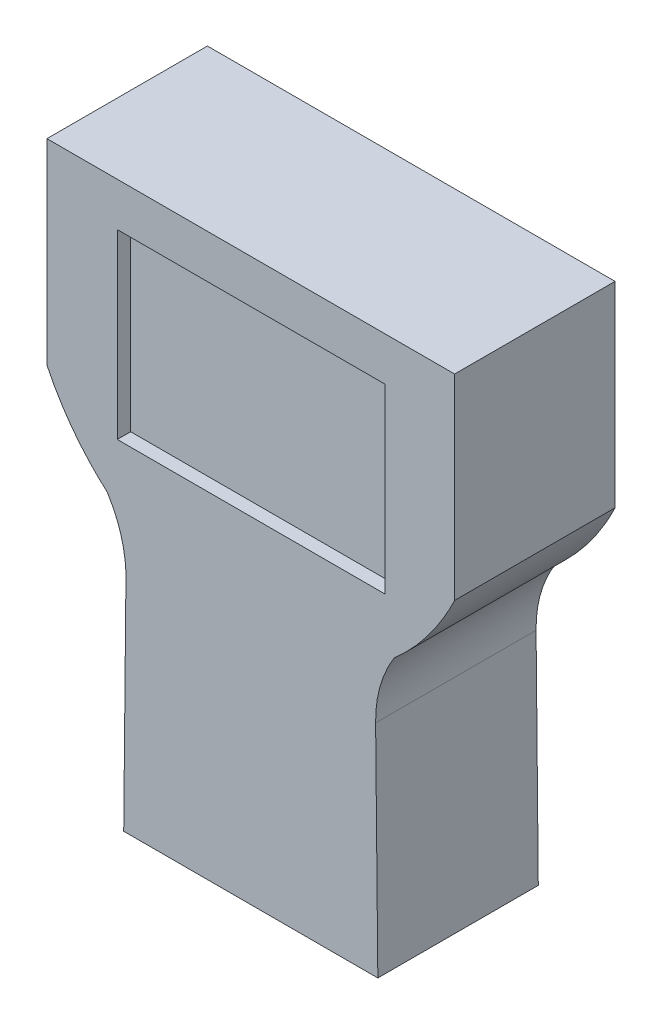
ISO-10303-21;
HEADER;
FILE_DESCRIPTION(('STEP AP214'),'2;1');
FILE_NAME('part.step','',(''),(''),'','','');
FILE_SCHEMA(('AUTOMOTIVE_DESIGN { 1 0 10303 214 1 1 1 1 }'));
ENDSEC;
DATA;
#1=APPLICATION_CONTEXT('core data for automotive mechanical design processes');
#2=APPLICATION_PROTOCOL_DEFINITION('international standard','automotive_design',2000,#1);
#3=PRODUCT_CONTEXT('',#1,'mechanical');
#4=PRODUCT('Part','Part','',(#3));
#5=PRODUCT_RELATED_PRODUCT_CATEGORY('part','',(#4));
#6=PRODUCT_DEFINITION_FORMATION('','',#4);
#7=PRODUCT_DEFINITION_CONTEXT('part definition',#1,'design');
#8=PRODUCT_DEFINITION('design','',#6,#7);
#9=PRODUCT_DEFINITION_SHAPE('','',#8);
#10=(LENGTH_UNIT() NAMED_UNIT(*) SI_UNIT(.MILLI.,.METRE.));
#11=(NAMED_UNIT(*) PLANE_ANGLE_UNIT() SI_UNIT($,.RADIAN.));
#12=(NAMED_UNIT(*) SI_UNIT($,.STERADIAN.) SOLID_ANGLE_UNIT());
#13=UNCERTAINTY_MEASURE_WITH_UNIT(LENGTH_MEASURE(1.E-05),#10,'distance_accuracy_value','');
#14=(GEOMETRIC_REPRESENTATION_CONTEXT(3) GLOBAL_UNCERTAINTY_ASSIGNED_CONTEXT((#13)) GLOBAL_UNIT_ASSIGNED_CONTEXT((#10,
#11,#12)) REPRESENTATION_CONTEXT('',''));
#15=CARTESIAN_POINT('',(0.,0.,0.));
#16=DIRECTION('',(0.,0.,1.));
#17=DIRECTION('',(1.,0.,0.));
#18=AXIS2_PLACEMENT_3D('',#15,#16,#17);
#19=CARTESIAN_POINT('',(-30.1445416899274,29.3855430183357,30.));
#20=DIRECTION('',(0.,-1.,0.));
#21=DIRECTION('',(0.,0.,-1.));
#22=AXIS2_PLACEMENT_3D('',#19,#20,#21);
#23=PLANE('',#22);
#24=DIRECTION('',(-1.,0.,0.));
#25=VECTOR('',#24,1.);
#26=CARTESIAN_POINT('',(-30.1445416899274,29.3855430183357,0.));
#27=LINE('',#26,#25);
#28=CARTESIAN_POINT('',(46.0787537208365,29.3855430183357,0.));
#29=VERTEX_POINT('',#28);
#30=CARTESIAN_POINT('',(-30.1445416899274,29.3855430183357,0.));
#31=VERTEX_POINT('',#30);
#32=EDGE_CURVE('E97',#29,#31,#27,.T.);
#33=ORIENTED_EDGE('',*,*,#32,.T.);
#34=DIRECTION('',(0.,0.,-1.));
#35=VECTOR('',#34,1.);
#36=CARTESIAN_POINT('',(-30.1445416899274,29.3855430183357,30.));
#37=LINE('',#36,#35);
#38=CARTESIAN_POINT('',(-30.1445416899274,29.3855430183357,30.));
#39=VERTEX_POINT('',#38);
#40=EDGE_CURVE('E11',#39,#31,#37,.T.);
#41=ORIENTED_EDGE('',*,*,#40,.F.);
#42=DIRECTION('',(-1.,0.,0.));
#43=VECTOR('',#42,1.);
#44=CARTESIAN_POINT('',(25.0462866282985,29.3855430183357,30.));
#45=LINE('',#44,#43);
#46=CARTESIAN_POINT('',(46.0787537208365,29.3855430183357,30.));
#47=VERTEX_POINT('',#46);
#48=EDGE_CURVE('E103',#47,#39,#45,.T.);
#49=ORIENTED_EDGE('',*,*,#48,.F.);
#50=DIRECTION('',(0.,0.,-1.));
#51=VECTOR('',#50,1.);
#52=CARTESIAN_POINT('',(46.0787537208365,29.3855430183357,30.));
#53=LINE('',#52,#51);
#54=EDGE_CURVE('E151',#47,#29,#53,.T.);
#55=ORIENTED_EDGE('',*,*,#54,.T.);
#56=EDGE_LOOP('',(#33,#41,#49,#55));
#57=FACE_BOUND('',#56,.T.);
#58=ADVANCED_FACE('F35',(#57),#23,.F.);
#59=CARTESIAN_POINT('',(-30.1445416899274,29.3855430183357,30.));
#60=DIRECTION('',(1.,0.,0.));
#61=DIRECTION('',(0.,0.,-1.));
#62=AXIS2_PLACEMENT_3D('',#59,#60,#61);
#63=PLANE('',#62);
#64=DIRECTION('',(0.,-1.,0.));
#65=VECTOR('',#64,1.);
#66=CARTESIAN_POINT('',(-30.1445416899274,29.3855430183357,0.));
#67=LINE('',#66,#65);
#68=CARTESIAN_POINT('',(-30.1445416899274,-7.27706518039059,0.));
#69=VERTEX_POINT('',#68);
#70=EDGE_CURVE('E240',#31,#69,#67,.T.);
#71=ORIENTED_EDGE('',*,*,#70,.T.);
#72=DIRECTION('',(0.,0.,-1.));
#73=VECTOR('',#72,1.);
#74=CARTESIAN_POINT('',(-30.1445416899274,-7.27706518039059,30.));
#75=LINE('',#74,#73);
#76=CARTESIAN_POINT('',(-30.1445416899274,-7.27706518039059,30.));
#77=VERTEX_POINT('',#76);
#78=EDGE_CURVE('E42',#77,#69,#75,.T.);
#79=ORIENTED_EDGE('',*,*,#78,.F.);
#80=DIRECTION('',(0.,-1.,0.));
#81=VECTOR('',#80,1.);
#82=CARTESIAN_POINT('',(-30.1445416899274,29.3855430183357,30.));
#83=LINE('',#82,#81);
#84=EDGE_CURVE('E280',#39,#77,#83,.T.);
#85=ORIENTED_EDGE('',*,*,#84,.F.);
#86=ORIENTED_EDGE('',*,*,#40,.T.);
#87=EDGE_LOOP('',(#71,#79,#85,#86));
#88=FACE_BOUND('',#87,.T.);
#89=ADVANCED_FACE('F354',(#88),#63,.F.);
#90=CARTESIAN_POINT('',(-30.1445416899274,-7.27706518039059,30.));
#91=CARTESIAN_POINT('',(-25.9941791136235,-15.9453342429556,30.));
#92=CARTESIAN_POINT('',(-18.8775459212392,-22.1982217389237,30.));
#93=B_SPLINE_CURVE_WITH_KNOTS('',2,(#90,#91,#92),.UNSPECIFIED.,.F.,.F.,(3,3),(0.,1.),.UNSPECIFIED.);
#94=DIRECTION('',(0.,0.,-1.));
#95=VECTOR('',#94,1.);
#96=SURFACE_OF_LINEAR_EXTRUSION('',#93,#95);
#97=CARTESIAN_POINT('',(-30.1445416899274,-7.27706518039059,0.));
#98=CARTESIAN_POINT('',(-25.9941791136235,-15.9453342429556,0.));
#99=CARTESIAN_POINT('',(-18.8775459212392,-22.1982217389237,0.));
#100=B_SPLINE_CURVE_WITH_KNOTS('',2,(#97,#98,#99),.UNSPECIFIED.,.F.,.F.,(3,3),(0.,1.),.UNSPECIFIED.);
#101=CARTESIAN_POINT('',(-18.8775459212392,-22.1982217389237,0.));
#102=VERTEX_POINT('',#101);
#103=EDGE_CURVE('E235',#69,#102,#100,.T.);
#104=ORIENTED_EDGE('',*,*,#103,.T.);
#105=DIRECTION('',(0.,0.,-1.));
#106=VECTOR('',#105,1.);
#107=CARTESIAN_POINT('',(-18.8775459212392,-22.1982217389237,30.));
#108=LINE('',#107,#106);
#109=CARTESIAN_POINT('',(-18.8775459212392,-22.1982217389237,30.));
#110=VERTEX_POINT('',#109);
#111=EDGE_CURVE('E227',#110,#102,#108,.T.);
#112=ORIENTED_EDGE('',*,*,#111,.F.);
#113=EDGE_CURVE('E197',#77,#110,#93,.T.);
#114=ORIENTED_EDGE('',*,*,#113,.F.);
#115=ORIENTED_EDGE('',*,*,#78,.T.);
#116=EDGE_LOOP('',(#104,#112,#114,#115));
#117=FACE_BOUND('',#116,.T.);
#118=ADVANCED_FACE('F188',(#117),#96,.F.);
#119=CARTESIAN_POINT('',(-18.8775459212392,-22.1982217389237,30.));
#120=CARTESIAN_POINT('',(-16.4983142615658,-25.9922085247033,30.));
#121=CARTESIAN_POINT('',(-15.3308835428001,-30.0895736373616,30.));
#122=CARTESIAN_POINT('',(-15.3752537649422,-34.4903170768981,30.));
#123=B_SPLINE_CURVE_WITH_KNOTS('',3,(#119,#120,#121,#122),.UNSPECIFIED.,.F.,.F.,(4,4),(0.,1.),.UNSPECIFIED.);
#124=DIRECTION('',(0.,0.,-1.));
#125=VECTOR('',#124,1.);
#126=SURFACE_OF_LINEAR_EXTRUSION('',#123,#125);
#127=CARTESIAN_POINT('',(-18.8775459212392,-22.1982217389237,0.));
#128=CARTESIAN_POINT('',(-16.4983142615658,-25.9922085247033,0.));
#129=CARTESIAN_POINT('',(-15.3308835428001,-30.0895736373616,0.));
#130=CARTESIAN_POINT('',(-15.3752537649422,-34.4903170768981,0.));
#131=B_SPLINE_CURVE_WITH_KNOTS('',3,(#127,#128,#129,#130),.UNSPECIFIED.,.F.,.F.,(4,4),(0.,1.),.UNSPECIFIED.);
#132=CARTESIAN_POINT('',(-15.3752537649422,-34.4903170768981,0.));
#133=VERTEX_POINT('',#132);
#134=EDGE_CURVE('E242',#102,#133,#131,.T.);
#135=ORIENTED_EDGE('',*,*,#134,.T.);
#136=DIRECTION('',(0.,0.,-1.));
#137=VECTOR('',#136,1.);
#138=CARTESIAN_POINT('',(-15.3752537649422,-34.4903170768981,30.));
#139=LINE('',#138,#137);
#140=CARTESIAN_POINT('',(-15.3752537649422,-34.4903170768981,30.));
#141=VERTEX_POINT('',#140);
#142=EDGE_CURVE('E224',#141,#133,#139,.T.);
#143=ORIENTED_EDGE('',*,*,#142,.F.);
#144=EDGE_CURVE('E191',#110,#141,#123,.T.);
#145=ORIENTED_EDGE('',*,*,#144,.F.);
#146=ORIENTED_EDGE('',*,*,#111,.T.);
#147=EDGE_LOOP('',(#135,#143,#145,#146));
#148=FACE_BOUND('',#147,.T.);
#149=ADVANCED_FACE('F183',(#148),#126,.F.);
#150=CARTESIAN_POINT('',(-15.3752537649422,-34.4903170768981,30.));
#151=DIRECTION('',(0.999949176098552,-0.0100819254028058,0.));
#152=DIRECTION('',(0.0100819254028058,0.999949176098552,0.));
#153=AXIS2_PLACEMENT_3D('',#150,#151,#152);
#154=PLANE('',#153);
#155=DIRECTION('',(-0.0100819254028058,-0.999949176098552,0.));
#156=VECTOR('',#155,1.);
#157=CARTESIAN_POINT('',(-15.3752537649422,-34.4903170768981,0.));
#158=LINE('',#157,#156);
#159=CARTESIAN_POINT('',(-15.7896415441457,-75.5902758491062,0.));
#160=VERTEX_POINT('',#159);
#161=EDGE_CURVE('E244',#133,#160,#158,.T.);
#162=ORIENTED_EDGE('',*,*,#161,.T.);
#163=DIRECTION('',(0.,0.,-1.));
#164=VECTOR('',#163,1.);
#165=CARTESIAN_POINT('',(-15.7896415441457,-75.5902758491062,30.));
#166=LINE('',#165,#164);
#167=CARTESIAN_POINT('',(-15.7896415441457,-75.5902758491062,30.));
#168=VERTEX_POINT('',#167);
#169=EDGE_CURVE('E217',#168,#160,#166,.T.);
#170=ORIENTED_EDGE('',*,*,#169,.F.);
#171=DIRECTION('',(-0.0100819254028058,-0.999949176098552,0.));
#172=VECTOR('',#171,1.);
#173=CARTESIAN_POINT('',(-15.3752537649422,-34.4903170768981,30.));
#174=LINE('',#173,#172);
#175=EDGE_CURVE('E196',#141,#168,#174,.T.);
#176=ORIENTED_EDGE('',*,*,#175,.F.);
#177=ORIENTED_EDGE('',*,*,#142,.T.);
#178=EDGE_LOOP('',(#162,#170,#176,#177));
#179=FACE_BOUND('',#178,.T.);
#180=ADVANCED_FACE('F179',(#179),#154,.F.);
#181=CARTESIAN_POINT('',(31.7238535750548,-75.5902758491062,30.));
#182=DIRECTION('',(0.,1.,0.));
#183=DIRECTION('',(0.,0.,1.));
#184=AXIS2_PLACEMENT_3D('',#181,#182,#183);
#185=PLANE('',#184);
#186=DIRECTION('',(1.,0.,0.));
#187=VECTOR('',#186,1.);
#188=CARTESIAN_POINT('',(31.7238535750548,-75.5902758491062,0.));
#189=LINE('',#188,#187);
#190=CARTESIAN_POINT('',(31.7238535750548,-75.5902758491062,0.));
#191=VERTEX_POINT('',#190);
#192=EDGE_CURVE('E215',#160,#191,#189,.T.);
#193=ORIENTED_EDGE('',*,*,#192,.T.);
#194=DIRECTION('',(0.,0.,-1.));
#195=VECTOR('',#194,1.);
#196=CARTESIAN_POINT('',(31.7238535750548,-75.5902758491062,30.));
#197=LINE('',#196,#195);
#198=CARTESIAN_POINT('',(31.7238535750548,-75.5902758491062,30.));
#199=VERTEX_POINT('',#198);
#200=EDGE_CURVE('E213',#199,#191,#197,.T.);
#201=ORIENTED_EDGE('',*,*,#200,.F.);
#202=DIRECTION('',(1.,0.,0.));
#203=VECTOR('',#202,1.);
#204=CARTESIAN_POINT('',(31.7238535750548,-75.5902758491062,30.));
#205=LINE('',#204,#203);
#206=EDGE_CURVE('E206',#168,#199,#205,.T.);
#207=ORIENTED_EDGE('',*,*,#206,.F.);
#208=ORIENTED_EDGE('',*,*,#169,.T.);
#209=EDGE_LOOP('',(#193,#201,#207,#208));
#210=FACE_BOUND('',#209,.T.);
#211=ADVANCED_FACE('F175',(#210),#185,.F.);
#212=CARTESIAN_POINT('',(31.3094657958513,-34.4903170768981,30.));
#213=DIRECTION('',(-0.999949176098552,-0.0100819254028058,0.));
#214=DIRECTION('',(0.0100819254028058,-0.999949176098552,0.));
#215=AXIS2_PLACEMENT_3D('',#212,#213,#214);
#216=PLANE('',#215);
#217=DIRECTION('',(-0.0100819254028058,0.999949176098552,0.));
#218=VECTOR('',#217,1.);
#219=CARTESIAN_POINT('',(31.3094657958513,-34.4903170768981,0.));
#220=LINE('',#219,#218);
#221=CARTESIAN_POINT('',(31.3094657958513,-34.4903170768981,0.));
#222=VERTEX_POINT('',#221);
#223=EDGE_CURVE('E219',#191,#222,#220,.T.);
#224=ORIENTED_EDGE('',*,*,#223,.T.);
#225=DIRECTION('',(0.,0.,-1.));
#226=VECTOR('',#225,1.);
#227=CARTESIAN_POINT('',(31.3094657958513,-34.4903170768981,30.));
#228=LINE('',#227,#226);
#229=CARTESIAN_POINT('',(31.3094657958513,-34.4903170768981,30.));
#230=VERTEX_POINT('',#229);
#231=EDGE_CURVE('E145',#230,#222,#228,.T.);
#232=ORIENTED_EDGE('',*,*,#231,.F.);
#233=DIRECTION('',(-0.0100819254028058,0.999949176098552,0.));
#234=VECTOR('',#233,1.);
#235=CARTESIAN_POINT('',(31.3094657958513,-34.4903170768981,30.));
#236=LINE('',#235,#234);
#237=EDGE_CURVE('E133',#199,#230,#236,.T.);
#238=ORIENTED_EDGE('',*,*,#237,.F.);
#239=ORIENTED_EDGE('',*,*,#200,.T.);
#240=EDGE_LOOP('',(#224,#232,#238,#239));
#241=FACE_BOUND('',#240,.T.);
#242=ADVANCED_FACE('F172',(#241),#216,.F.);
#243=CARTESIAN_POINT('',(31.3094657958513,-34.4903170768981,30.));
#244=CARTESIAN_POINT('',(31.2650955737092,-30.0895736373617,30.));
#245=CARTESIAN_POINT('',(32.4325262924749,-25.9922085247033,30.));
#246=CARTESIAN_POINT('',(34.8117579521482,-22.1982217389237,30.));
#247=B_SPLINE_CURVE_WITH_KNOTS('',3,(#243,#244,#245,#246),.UNSPECIFIED.,.F.,.F.,(4,4),(0.,1.),.UNSPECIFIED.);
#248=DIRECTION('',(0.,0.,-1.));
#249=VECTOR('',#248,1.);
#250=SURFACE_OF_LINEAR_EXTRUSION('',#247,#249);
#251=CARTESIAN_POINT('',(31.3094657958513,-34.4903170768981,0.));
#252=CARTESIAN_POINT('',(31.2650955737092,-30.0895736373617,0.));
#253=CARTESIAN_POINT('',(32.4325262924749,-25.9922085247033,0.));
#254=CARTESIAN_POINT('',(34.8117579521482,-22.1982217389237,0.));
#255=B_SPLINE_CURVE_WITH_KNOTS('',3,(#251,#252,#253,#254),.UNSPECIFIED.,.F.,.F.,(4,4),(0.,1.),.UNSPECIFIED.);
#256=CARTESIAN_POINT('',(34.8117579521482,-22.1982217389237,0.));
#257=VERTEX_POINT('',#256);
#258=EDGE_CURVE('E142',#222,#257,#255,.T.);
#259=ORIENTED_EDGE('',*,*,#258,.T.);
#260=DIRECTION('',(0.,0.,-1.));
#261=VECTOR('',#260,1.);
#262=CARTESIAN_POINT('',(34.8117579521482,-22.1982217389237,30.));
#263=LINE('',#262,#261);
#264=CARTESIAN_POINT('',(34.8117579521482,-22.1982217389237,30.));
#265=VERTEX_POINT('',#264);
#266=EDGE_CURVE('E139',#265,#257,#263,.T.);
#267=ORIENTED_EDGE('',*,*,#266,.F.);
#268=EDGE_CURVE('E126',#230,#265,#247,.T.);
#269=ORIENTED_EDGE('',*,*,#268,.F.);
#270=ORIENTED_EDGE('',*,*,#231,.T.);
#271=EDGE_LOOP('',(#259,#267,#269,#270));
#272=FACE_BOUND('',#271,.T.);
#273=ADVANCED_FACE('F140',(#272),#250,.F.);
#274=CARTESIAN_POINT('',(34.8117579521482,-22.1982217389237,30.));
#275=CARTESIAN_POINT('',(41.9283911445325,-15.9453342429556,30.));
#276=CARTESIAN_POINT('',(46.0787537208365,-7.27706518039059,30.));
#277=B_SPLINE_CURVE_WITH_KNOTS('',2,(#274,#275,#276),.UNSPECIFIED.,.F.,.F.,(3,3),(0.,1.),.UNSPECIFIED.);
#278=DIRECTION('',(0.,0.,-1.));
#279=VECTOR('',#278,1.);
#280=SURFACE_OF_LINEAR_EXTRUSION('',#277,#279);
#281=CARTESIAN_POINT('',(34.8117579521482,-22.1982217389237,0.));
#282=CARTESIAN_POINT('',(41.9283911445325,-15.9453342429556,0.));
#283=CARTESIAN_POINT('',(46.0787537208365,-7.27706518039059,0.));
#284=B_SPLINE_CURVE_WITH_KNOTS('',2,(#281,#282,#283),.UNSPECIFIED.,.F.,.F.,(3,3),(0.,1.),.UNSPECIFIED.);
#285=CARTESIAN_POINT('',(46.0787537208365,-7.27706518039059,0.));
#286=VERTEX_POINT('',#285);
#287=EDGE_CURVE('E264',#257,#286,#284,.T.);
#288=ORIENTED_EDGE('',*,*,#287,.T.);
#289=DIRECTION('',(0.,0.,-1.));
#290=VECTOR('',#289,1.);
#291=CARTESIAN_POINT('',(46.0787537208365,-7.27706518039059,30.));
#292=LINE('',#291,#290);
#293=CARTESIAN_POINT('',(46.0787537208365,-7.27706518039059,30.));
#294=VERTEX_POINT('',#293);
#295=EDGE_CURVE('E146',#294,#286,#292,.T.);
#296=ORIENTED_EDGE('',*,*,#295,.F.);
#297=EDGE_CURVE('E130',#265,#294,#277,.T.);
#298=ORIENTED_EDGE('',*,*,#297,.F.);
#299=ORIENTED_EDGE('',*,*,#266,.T.);
#300=EDGE_LOOP('',(#288,#296,#298,#299));
#301=FACE_BOUND('',#300,.T.);
#302=ADVANCED_FACE('F148',(#301),#280,.F.);
#303=CARTESIAN_POINT('',(46.0787537208365,29.3855430183357,30.));
#304=DIRECTION('',(-1.,0.,0.));
#305=DIRECTION('',(0.,0.,1.));
#306=AXIS2_PLACEMENT_3D('',#303,#304,#305);
#307=PLANE('',#306);
#308=DIRECTION('',(0.,1.,0.));
#309=VECTOR('',#308,1.);
#310=CARTESIAN_POINT('',(46.0787537208365,29.3855430183357,0.));
#311=LINE('',#310,#309);
#312=EDGE_CURVE('E271',#286,#29,#311,.T.);
#313=ORIENTED_EDGE('',*,*,#312,.T.);
#314=ORIENTED_EDGE('',*,*,#54,.F.);
#315=DIRECTION('',(0.,1.,0.));
#316=VECTOR('',#315,1.);
#317=CARTESIAN_POINT('',(46.0787537208365,29.3855430183357,30.));
#318=LINE('',#317,#316);
#319=EDGE_CURVE('E58',#294,#47,#318,.T.);
#320=ORIENTED_EDGE('',*,*,#319,.F.);
#321=ORIENTED_EDGE('',*,*,#295,.T.);
#322=EDGE_LOOP('',(#313,#314,#320,#321));
#323=FACE_BOUND('',#322,.T.);
#324=ADVANCED_FACE('F168',(#323),#307,.F.);
#325=CARTESIAN_POINT('',(41.1868234905125,-15.3414888513064,30.));
#326=DIRECTION('',(0.,0.,1.));
#327=DIRECTION('',(1.,0.,0.));
#328=AXIS2_PLACEMENT_3D('',#325,#326,#327);
#329=PLANE('',#328);
#330=DIRECTION('',(1.,0.,0.));
#331=VECTOR('',#330,1.);
#332=CARTESIAN_POINT('',(-16.9919785909609,-12.7470015254894,30.));
#333=LINE('',#332,#331);
#334=CARTESIAN_POINT('',(-16.9919785909609,-12.7470015254894,30.));
#335=VERTEX_POINT('',#334);
#336=CARTESIAN_POINT('',(33.1032054063126,-12.7470015254894,30.));
#337=VERTEX_POINT('',#336);
#338=EDGE_CURVE('E49',#335,#337,#333,.T.);
#339=ORIENTED_EDGE('',*,*,#338,.F.);
#340=DIRECTION('',(0.,-1.,0.));
#341=VECTOR('',#340,1.);
#342=CARTESIAN_POINT('',(-16.9919785909609,21.2398370875018,30.));
#343=LINE('',#342,#341);
#344=CARTESIAN_POINT('',(-16.9919785909609,21.2398370875018,30.));
#345=VERTEX_POINT('',#344);
#346=EDGE_CURVE('E294',#345,#335,#343,.T.);
#347=ORIENTED_EDGE('',*,*,#346,.F.);
#348=DIRECTION('',(1.,0.,0.));
#349=VECTOR('',#348,1.);
#350=CARTESIAN_POINT('',(-16.9919785909609,21.2398370875018,30.));
#351=LINE('',#350,#349);
#352=CARTESIAN_POINT('',(33.1032054063126,21.2398370875018,30.));
#353=VERTEX_POINT('',#352);
#354=EDGE_CURVE('E298',#345,#353,#351,.T.);
#355=ORIENTED_EDGE('',*,*,#354,.T.);
#356=DIRECTION('',(0.,-1.,0.));
#357=VECTOR('',#356,1.);
#358=CARTESIAN_POINT('',(33.1032054063126,21.2398370875018,30.));
#359=LINE('',#358,#357);
#360=EDGE_CURVE('E301',#353,#337,#359,.T.);
#361=ORIENTED_EDGE('',*,*,#360,.T.);
#362=EDGE_LOOP('',(#339,#347,#355,#361));
#363=FACE_BOUND('',#362,.T.);
#364=ORIENTED_EDGE('',*,*,#48,.T.);
#365=ORIENTED_EDGE('',*,*,#84,.T.);
#366=ORIENTED_EDGE('',*,*,#113,.T.);
#367=ORIENTED_EDGE('',*,*,#144,.T.);
#368=ORIENTED_EDGE('',*,*,#175,.T.);
#369=ORIENTED_EDGE('',*,*,#206,.T.);
#370=ORIENTED_EDGE('',*,*,#237,.T.);
#371=ORIENTED_EDGE('',*,*,#268,.T.);
#372=ORIENTED_EDGE('',*,*,#297,.T.);
#373=ORIENTED_EDGE('',*,*,#319,.T.);
#374=EDGE_LOOP('',(#364,#365,#366,#367,#368,#369,#370,#371,#372,#373));
#375=FACE_BOUND('',#374,.T.);
#376=ADVANCED_FACE('F128',(#363,#375),#329,.T.);
#377=CARTESIAN_POINT('',(41.1868234905125,-15.3414888513064,0.));
#378=DIRECTION('',(0.,0.,1.));
#379=DIRECTION('',(1.,0.,0.));
#380=AXIS2_PLACEMENT_3D('',#377,#378,#379);
#381=PLANE('',#380);
#382=ORIENTED_EDGE('',*,*,#32,.F.);
#383=ORIENTED_EDGE('',*,*,#312,.F.);
#384=ORIENTED_EDGE('',*,*,#287,.F.);
#385=ORIENTED_EDGE('',*,*,#258,.F.);
#386=ORIENTED_EDGE('',*,*,#223,.F.);
#387=ORIENTED_EDGE('',*,*,#192,.F.);
#388=ORIENTED_EDGE('',*,*,#161,.F.);
#389=ORIENTED_EDGE('',*,*,#134,.F.);
#390=ORIENTED_EDGE('',*,*,#103,.F.);
#391=ORIENTED_EDGE('',*,*,#70,.F.);
#392=EDGE_LOOP('',(#382,#383,#384,#385,#386,#387,#388,#389,#390,#391));
#393=FACE_BOUND('',#392,.T.);
#394=ADVANCED_FACE('F239',(#393),#381,.F.);
#395=CARTESIAN_POINT('',(-16.9919785909609,-12.7470015254894,27.5));
#396=DIRECTION('',(0.,-1.,0.));
#397=DIRECTION('',(0.,0.,-1.));
#398=AXIS2_PLACEMENT_3D('',#395,#396,#397);
#399=PLANE('',#398);
#400=ORIENTED_EDGE('',*,*,#338,.T.);
#401=DIRECTION('',(0.,0.,1.));
#402=VECTOR('',#401,1.);
#403=CARTESIAN_POINT('',(33.1032054063126,-12.7470015254894,27.5));
#404=LINE('',#403,#402);
#405=CARTESIAN_POINT('',(33.1032054063126,-12.7470015254894,27.5));
#406=VERTEX_POINT('',#405);
#407=EDGE_CURVE('E283',#406,#337,#404,.T.);
#408=ORIENTED_EDGE('',*,*,#407,.F.);
#409=DIRECTION('',(1.,0.,0.));
#410=VECTOR('',#409,1.);
#411=CARTESIAN_POINT('',(-16.9919785909609,-12.7470015254894,27.5));
#412=LINE('',#411,#410);
#413=CARTESIAN_POINT('',(-16.9919785909609,-12.7470015254894,27.5));
#414=VERTEX_POINT('',#413);
#415=EDGE_CURVE('E297',#414,#406,#412,.T.);
#416=ORIENTED_EDGE('',*,*,#415,.F.);
#417=DIRECTION('',(0.,0.,1.));
#418=VECTOR('',#417,1.);
#419=CARTESIAN_POINT('',(-16.9919785909609,-12.7470015254894,27.5));
#420=LINE('',#419,#418);
#421=EDGE_CURVE('E292',#414,#335,#420,.T.);
#422=ORIENTED_EDGE('',*,*,#421,.T.);
#423=EDGE_LOOP('',(#400,#408,#416,#422));
#424=FACE_BOUND('',#423,.T.);
#425=ADVANCED_FACE('F323',(#424),#399,.F.);
#426=CARTESIAN_POINT('',(-16.9919785909609,21.2398370875018,27.5));
#427=DIRECTION('',(-1.,0.,0.));
#428=DIRECTION('',(0.,0.,1.));
#429=AXIS2_PLACEMENT_3D('',#426,#427,#428);
#430=PLANE('',#429);
#431=ORIENTED_EDGE('',*,*,#346,.T.);
#432=ORIENTED_EDGE('',*,*,#421,.F.);
#433=DIRECTION('',(0.,-1.,0.));
#434=VECTOR('',#433,1.);
#435=CARTESIAN_POINT('',(-16.9919785909609,21.2398370875018,27.5));
#436=LINE('',#435,#434);
#437=CARTESIAN_POINT('',(-16.9919785909609,21.2398370875018,27.5));
#438=VERTEX_POINT('',#437);
#439=EDGE_CURVE('E286',#438,#414,#436,.T.);
#440=ORIENTED_EDGE('',*,*,#439,.F.);
#441=DIRECTION('',(0.,0.,1.));
#442=VECTOR('',#441,1.);
#443=CARTESIAN_POINT('',(-16.9919785909609,21.2398370875018,27.5));
#444=LINE('',#443,#442);
#445=EDGE_CURVE('E289',#438,#345,#444,.T.);
#446=ORIENTED_EDGE('',*,*,#445,.T.);
#447=EDGE_LOOP('',(#431,#432,#440,#446));
#448=FACE_BOUND('',#447,.T.);
#449=ADVANCED_FACE('F335',(#448),#430,.F.);
#450=CARTESIAN_POINT('',(-16.9919785909609,21.2398370875018,27.5));
#451=DIRECTION('',(0.,-1.,0.));
#452=DIRECTION('',(0.,0.,-1.));
#453=AXIS2_PLACEMENT_3D('',#450,#451,#452);
#454=PLANE('',#453);
#455=ORIENTED_EDGE('',*,*,#354,.F.);
#456=ORIENTED_EDGE('',*,*,#445,.F.);
#457=DIRECTION('',(1.,0.,0.));
#458=VECTOR('',#457,1.);
#459=CARTESIAN_POINT('',(-16.9919785909609,21.2398370875018,27.5));
#460=LINE('',#459,#458);
#461=CARTESIAN_POINT('',(33.1032054063126,21.2398370875018,27.5));
#462=VERTEX_POINT('',#461);
#463=EDGE_CURVE('E307',#438,#462,#460,.T.);
#464=ORIENTED_EDGE('',*,*,#463,.T.);
#465=DIRECTION('',(0.,0.,1.));
#466=VECTOR('',#465,1.);
#467=CARTESIAN_POINT('',(33.1032054063126,21.2398370875018,27.5));
#468=LINE('',#467,#466);
#469=EDGE_CURVE('E285',#462,#353,#468,.T.);
#470=ORIENTED_EDGE('',*,*,#469,.T.);
#471=EDGE_LOOP('',(#455,#456,#464,#470));
#472=FACE_BOUND('',#471,.T.);
#473=ADVANCED_FACE('F338',(#472),#454,.T.);
#474=CARTESIAN_POINT('',(33.1032054063126,21.2398370875018,27.5));
#475=DIRECTION('',(-1.,0.,0.));
#476=DIRECTION('',(0.,0.,1.));
#477=AXIS2_PLACEMENT_3D('',#474,#475,#476);
#478=PLANE('',#477);
#479=ORIENTED_EDGE('',*,*,#360,.F.);
#480=ORIENTED_EDGE('',*,*,#469,.F.);
#481=DIRECTION('',(0.,-1.,0.));
#482=VECTOR('',#481,1.);
#483=CARTESIAN_POINT('',(33.1032054063126,21.2398370875018,27.5));
#484=LINE('',#483,#482);
#485=EDGE_CURVE('E310',#462,#406,#484,.T.);
#486=ORIENTED_EDGE('',*,*,#485,.T.);
#487=ORIENTED_EDGE('',*,*,#407,.T.);
#488=EDGE_LOOP('',(#479,#480,#486,#487));
#489=FACE_BOUND('',#488,.T.);
#490=ADVANCED_FACE('F343',(#489),#478,.T.);
#491=CARTESIAN_POINT('',(0.,0.,27.5));
#492=DIRECTION('',(0.,0.,-1.));
#493=DIRECTION('',(-1.,0.,0.));
#494=AXIS2_PLACEMENT_3D('',#491,#492,#493);
#495=PLANE('',#494);
#496=ORIENTED_EDGE('',*,*,#415,.T.);
#497=ORIENTED_EDGE('',*,*,#485,.F.);
#498=ORIENTED_EDGE('',*,*,#463,.F.);
#499=ORIENTED_EDGE('',*,*,#439,.T.);
#500=EDGE_LOOP('',(#496,#497,#498,#499));
#501=FACE_BOUND('',#500,.T.);
#502=ADVANCED_FACE('F318',(#501),#495,.F.);
#503=CLOSED_SHELL('',(#58,#89,#118,#149,#180,#211,#242,#273,#302,#324,#376,#394,#425,#449,#473,
#490,#502));
#504=MANIFOLD_SOLID_BREP('B2',#503);
#505=ADVANCED_BREP_SHAPE_REPRESENTATION('',(#18,#504),#14);
#506=SHAPE_DEFINITION_REPRESENTATION(#9,#505);
ENDSEC;
END-ISO-10303-21;
